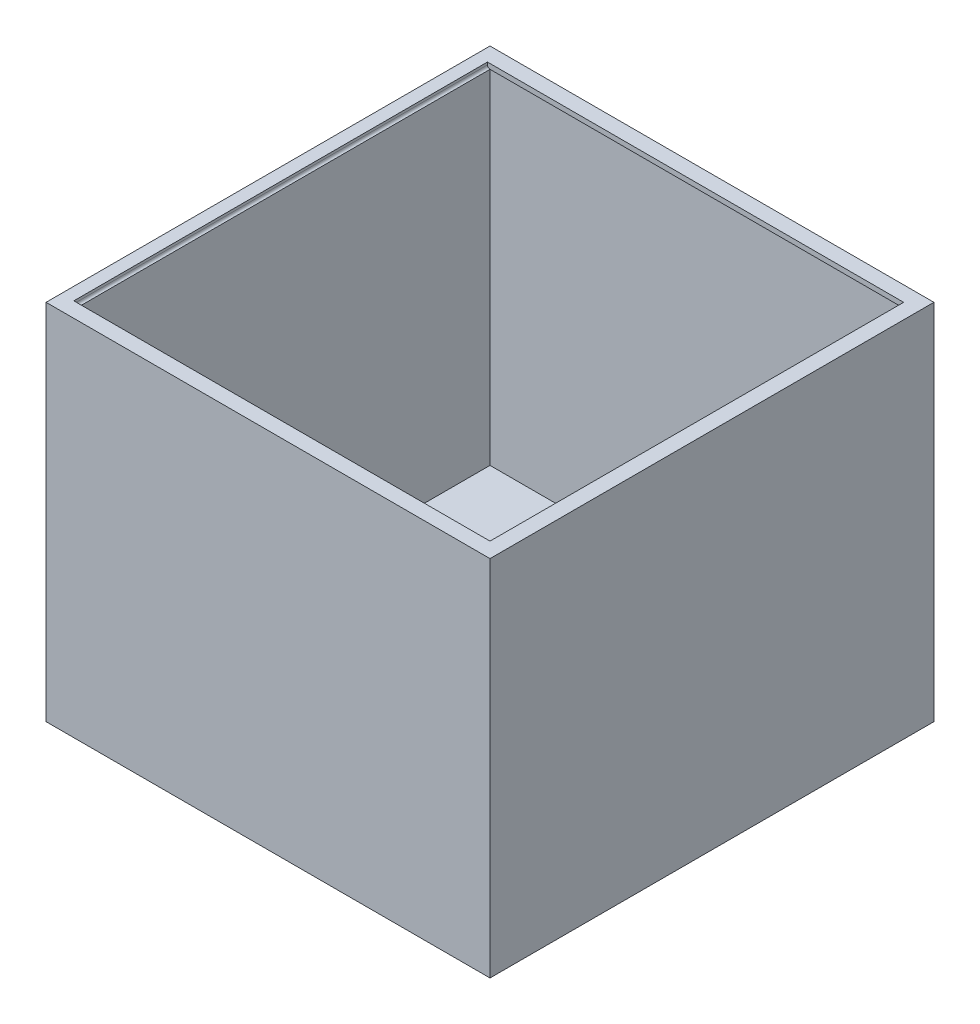
ISO-10303-21;
HEADER;
FILE_DESCRIPTION(('STEP AP214'),'2;1');
FILE_NAME('part.step','',(''),(''),'','','');
FILE_SCHEMA(('AUTOMOTIVE_DESIGN { 1 0 10303 214 1 1 1 1 }'));
ENDSEC;
DATA;
#1=APPLICATION_CONTEXT('core data for automotive mechanical design processes');
#2=APPLICATION_PROTOCOL_DEFINITION('international standard','automotive_design',2000,#1);
#3=PRODUCT_CONTEXT('',#1,'mechanical');
#4=PRODUCT('Part','Part','',(#3));
#5=PRODUCT_RELATED_PRODUCT_CATEGORY('part','',(#4));
#6=PRODUCT_DEFINITION_FORMATION('','',#4);
#7=PRODUCT_DEFINITION_CONTEXT('part definition',#1,'design');
#8=PRODUCT_DEFINITION('design','',#6,#7);
#9=PRODUCT_DEFINITION_SHAPE('','',#8);
#10=(LENGTH_UNIT() NAMED_UNIT(*) SI_UNIT(.MILLI.,.METRE.));
#11=(NAMED_UNIT(*) PLANE_ANGLE_UNIT() SI_UNIT($,.RADIAN.));
#12=(NAMED_UNIT(*) SI_UNIT($,.STERADIAN.) SOLID_ANGLE_UNIT());
#13=UNCERTAINTY_MEASURE_WITH_UNIT(LENGTH_MEASURE(1.E-05),#10,'distance_accuracy_value','');
#14=(GEOMETRIC_REPRESENTATION_CONTEXT(3) GLOBAL_UNCERTAINTY_ASSIGNED_CONTEXT((#13)) GLOBAL_UNIT_ASSIGNED_CONTEXT((#10,
#11,#12)) REPRESENTATION_CONTEXT('',''));
#15=CARTESIAN_POINT('',(0.,0.,0.));
#16=DIRECTION('',(0.,0.,1.));
#17=DIRECTION('',(1.,0.,0.));
#18=AXIS2_PLACEMENT_3D('',#15,#16,#17);
#19=CARTESIAN_POINT('',(2.17628945167999E-13,-60.,0.));
#20=DIRECTION('',(0.,1.,0.));
#21=DIRECTION('',(-1.,0.,0.));
#22=AXIS2_PLACEMENT_3D('',#19,#20,#21);
#23=PLANE('',#22);
#24=DIRECTION('',(0.,0.,1.));
#25=VECTOR('',#24,1.);
#26=CARTESIAN_POINT('',(-220.,-60.0000000000008,-220.));
#27=LINE('',#26,#25);
#28=CARTESIAN_POINT('',(-220.,-60.0000000000008,-220.));
#29=VERTEX_POINT('',#28);
#30=CARTESIAN_POINT('',(-220.,-60.0000000000008,220.));
#31=VERTEX_POINT('',#30);
#32=EDGE_CURVE('E216',#29,#31,#27,.T.);
#33=ORIENTED_EDGE('',*,*,#32,.F.);
#34=DIRECTION('',(-1.,0.,0.));
#35=VECTOR('',#34,1.);
#36=CARTESIAN_POINT('',(220.,-59.9999999999992,-220.));
#37=LINE('',#36,#35);
#38=CARTESIAN_POINT('',(220.,-59.9999999999992,-220.));
#39=VERTEX_POINT('',#38);
#40=EDGE_CURVE('E201',#39,#29,#37,.T.);
#41=ORIENTED_EDGE('',*,*,#40,.F.);
#42=DIRECTION('',(0.,0.,-1.));
#43=VECTOR('',#42,1.);
#44=CARTESIAN_POINT('',(220.,-59.9999999999992,220.));
#45=LINE('',#44,#43);
#46=CARTESIAN_POINT('',(220.,-59.9999999999992,220.));
#47=VERTEX_POINT('',#46);
#48=EDGE_CURVE('E206',#47,#39,#45,.T.);
#49=ORIENTED_EDGE('',*,*,#48,.F.);
#50=DIRECTION('',(1.,0.,0.));
#51=VECTOR('',#50,1.);
#52=CARTESIAN_POINT('',(-220.,-60.0000000000008,220.));
#53=LINE('',#52,#51);
#54=EDGE_CURVE('E211',#31,#47,#53,.T.);
#55=ORIENTED_EDGE('',*,*,#54,.F.);
#56=EDGE_LOOP('',(#33,#41,#49,#55));
#57=FACE_BOUND('',#56,.T.);
#58=ADVANCED_FACE('F39',(#57),#23,.F.);
#59=CARTESIAN_POINT('',(-220.000000000003,922.253967444163,-220.));
#60=DIRECTION('',(1.,0.,0.));
#61=DIRECTION('',(0.,1.,0.));
#62=AXIS2_PLACEMENT_3D('',#59,#60,#61);
#63=PLANE('',#62);
#64=ORIENTED_EDGE('',*,*,#32,.T.);
#65=DIRECTION('',(0.,-1.,0.));
#66=VECTOR('',#65,1.);
#67=CARTESIAN_POINT('',(-220.000000000003,922.253967444163,220.));
#68=LINE('',#67,#66);
#69=CARTESIAN_POINT('',(-220.000000000003,300.,220.));
#70=VERTEX_POINT('',#69);
#71=EDGE_CURVE('E215',#70,#31,#68,.T.);
#72=ORIENTED_EDGE('',*,*,#71,.F.);
#73=DIRECTION('',(0.,0.,-1.));
#74=VECTOR('',#73,1.);
#75=CARTESIAN_POINT('',(-220.000000000001,300.,-220.));
#76=LINE('',#75,#74);
#77=CARTESIAN_POINT('',(-220.000000000004,300.,-220.));
#78=VERTEX_POINT('',#77);
#79=EDGE_CURVE('E200',#70,#78,#76,.T.);
#80=ORIENTED_EDGE('',*,*,#79,.T.);
#81=DIRECTION('',(0.,-1.,0.));
#82=VECTOR('',#81,1.);
#83=CARTESIAN_POINT('',(-220.000000000003,922.253967444163,-220.));
#84=LINE('',#83,#82);
#85=EDGE_CURVE('E220',#78,#29,#84,.T.);
#86=ORIENTED_EDGE('',*,*,#85,.T.);
#87=EDGE_LOOP('',(#64,#72,#80,#86));
#88=FACE_BOUND('',#87,.T.);
#89=ADVANCED_FACE('F274',(#88),#63,.F.);
#90=CARTESIAN_POINT('',(-220.000000000003,922.253967444163,220.));
#91=DIRECTION('',(0.,0.,-1.));
#92=DIRECTION('',(-1.,0.,0.));
#93=AXIS2_PLACEMENT_3D('',#90,#91,#92);
#94=PLANE('',#93);
#95=ORIENTED_EDGE('',*,*,#54,.T.);
#96=DIRECTION('',(0.,-1.,0.));
#97=VECTOR('',#96,1.);
#98=CARTESIAN_POINT('',(219.999999999996,922.253967444165,220.));
#99=LINE('',#98,#97);
#100=CARTESIAN_POINT('',(219.999999999999,300.000000000005,220.));
#101=VERTEX_POINT('',#100);
#102=EDGE_CURVE('E210',#101,#47,#99,.T.);
#103=ORIENTED_EDGE('',*,*,#102,.F.);
#104=DIRECTION('',(-1.,0.,0.));
#105=VECTOR('',#104,1.);
#106=CARTESIAN_POINT('',(-219.999999999997,300.,220.));
#107=LINE('',#106,#105);
#108=EDGE_CURVE('E219',#101,#70,#107,.T.);
#109=ORIENTED_EDGE('',*,*,#108,.T.);
#110=ORIENTED_EDGE('',*,*,#71,.T.);
#111=EDGE_LOOP('',(#95,#103,#109,#110));
#112=FACE_BOUND('',#111,.T.);
#113=ADVANCED_FACE('F280',(#112),#94,.F.);
#114=CARTESIAN_POINT('',(219.999999999996,922.253967444165,220.));
#115=DIRECTION('',(-1.,0.,0.));
#116=DIRECTION('',(0.,-1.,0.));
#117=AXIS2_PLACEMENT_3D('',#114,#115,#116);
#118=PLANE('',#117);
#119=ORIENTED_EDGE('',*,*,#48,.T.);
#120=DIRECTION('',(0.,-1.,0.));
#121=VECTOR('',#120,1.);
#122=CARTESIAN_POINT('',(219.999999999996,922.253967444165,-220.));
#123=LINE('',#122,#121);
#124=CARTESIAN_POINT('',(219.999999999999,300.000000000003,-220.));
#125=VERTEX_POINT('',#124);
#126=EDGE_CURVE('E205',#125,#39,#123,.T.);
#127=ORIENTED_EDGE('',*,*,#126,.F.);
#128=DIRECTION('',(0.,0.,1.));
#129=VECTOR('',#128,1.);
#130=CARTESIAN_POINT('',(219.999999999999,300.000000000005,220.));
#131=LINE('',#130,#129);
#132=EDGE_CURVE('E214',#125,#101,#131,.T.);
#133=ORIENTED_EDGE('',*,*,#132,.T.);
#134=ORIENTED_EDGE('',*,*,#102,.T.);
#135=EDGE_LOOP('',(#119,#127,#133,#134));
#136=FACE_BOUND('',#135,.T.);
#137=ADVANCED_FACE('F289',(#136),#118,.F.);
#138=CARTESIAN_POINT('',(219.999999999996,922.253967444165,-220.));
#139=DIRECTION('',(0.,0.,1.));
#140=DIRECTION('',(1.,0.,0.));
#141=AXIS2_PLACEMENT_3D('',#138,#139,#140);
#142=PLANE('',#141);
#143=ORIENTED_EDGE('',*,*,#40,.T.);
#144=ORIENTED_EDGE('',*,*,#85,.F.);
#145=DIRECTION('',(1.,0.,0.));
#146=VECTOR('',#145,1.);
#147=CARTESIAN_POINT('',(220.000000000003,300.000000000005,-220.));
#148=LINE('',#147,#146);
#149=EDGE_CURVE('E209',#78,#125,#148,.T.);
#150=ORIENTED_EDGE('',*,*,#149,.T.);
#151=ORIENTED_EDGE('',*,*,#126,.T.);
#152=EDGE_LOOP('',(#143,#144,#150,#151));
#153=FACE_BOUND('',#152,.T.);
#154=ADVANCED_FACE('F286',(#153),#142,.F.);
#155=CARTESIAN_POINT('',(-3.33066907387549E-12,300.000000000002,210.));
#156=DIRECTION('',(0.,-1.,0.));
#157=DIRECTION('',(1.,0.,0.));
#158=AXIS2_PLACEMENT_3D('',#155,#156,#157);
#159=PLANE('',#158);
#160=ORIENTED_EDGE('',*,*,#108,.F.);
#161=ORIENTED_EDGE('',*,*,#132,.F.);
#162=ORIENTED_EDGE('',*,*,#149,.F.);
#163=ORIENTED_EDGE('',*,*,#79,.F.);
#164=EDGE_LOOP('',(#160,#161,#162,#163));
#165=FACE_BOUND('',#164,.T.);
#166=DIRECTION('',(0.,0.,1.));
#167=VECTOR('',#166,1.);
#168=CARTESIAN_POINT('',(-207.500000000003,300.,-210.59016994375));
#169=LINE('',#168,#167);
#170=CARTESIAN_POINT('',(-207.500000000003,300.,-205.));
#171=VERTEX_POINT('',#170);
#172=CARTESIAN_POINT('',(-207.500000000003,300.,205.));
#173=VERTEX_POINT('',#172);
#174=EDGE_CURVE('E139',#171,#173,#169,.T.);
#175=ORIENTED_EDGE('',*,*,#174,.F.);
#176=DIRECTION('',(-1.,0.,0.));
#177=VECTOR('',#176,1.);
#178=CARTESIAN_POINT('',(-205.000000000004,300.,-205.));
#179=LINE('',#178,#177);
#180=CARTESIAN_POINT('',(204.999999999999,300.000000000005,-205.));
#181=VERTEX_POINT('',#180);
#182=EDGE_CURVE('E171',#181,#171,#179,.T.);
#183=ORIENTED_EDGE('',*,*,#182,.F.);
#184=DIRECTION('',(0.,0.,-1.));
#185=VECTOR('',#184,1.);
#186=CARTESIAN_POINT('',(204.999999999999,300.000000000005,-205.));
#187=LINE('',#186,#185);
#188=CARTESIAN_POINT('',(204.999999999999,300.000000000005,205.));
#189=VERTEX_POINT('',#188);
#190=EDGE_CURVE('E141',#189,#181,#187,.T.);
#191=ORIENTED_EDGE('',*,*,#190,.F.);
#192=DIRECTION('',(1.,0.,0.));
#193=VECTOR('',#192,1.);
#194=CARTESIAN_POINT('',(204.999999999999,300.000000000005,205.));
#195=LINE('',#194,#193);
#196=EDGE_CURVE('E136',#173,#189,#195,.T.);
#197=ORIENTED_EDGE('',*,*,#196,.F.);
#198=EDGE_LOOP('',(#175,#183,#191,#197));
#199=FACE_BOUND('',#198,.T.);
#200=ADVANCED_FACE('F41',(#165,#199),#159,.F.);
#201=CARTESIAN_POINT('',(-3.27515792264422E-12,295.000000000002,0.));
#202=DIRECTION('',(0.,-1.,0.));
#203=DIRECTION('',(1.,0.,0.));
#204=AXIS2_PLACEMENT_3D('',#201,#202,#203);
#205=PLANE('',#204);
#206=DIRECTION('',(1.,0.,0.));
#207=VECTOR('',#206,1.);
#208=CARTESIAN_POINT('',(215.000000000003,295.000000000005,-215.));
#209=LINE('',#208,#207);
#210=CARTESIAN_POINT('',(-215.000000000001,295.,-215.));
#211=VERTEX_POINT('',#210);
#212=CARTESIAN_POINT('',(214.999999999999,295.000000000002,-215.));
#213=VERTEX_POINT('',#212);
#214=EDGE_CURVE('E61',#211,#213,#209,.T.);
#215=ORIENTED_EDGE('',*,*,#214,.T.);
#216=DIRECTION('',(0.,0.,1.));
#217=VECTOR('',#216,1.);
#218=CARTESIAN_POINT('',(214.999999999999,295.000000000005,215.));
#219=LINE('',#218,#217);
#220=CARTESIAN_POINT('',(214.999999999999,295.000000000002,215.));
#221=VERTEX_POINT('',#220);
#222=EDGE_CURVE('E54',#213,#221,#219,.T.);
#223=ORIENTED_EDGE('',*,*,#222,.T.);
#224=DIRECTION('',(-1.,0.,0.));
#225=VECTOR('',#224,1.);
#226=CARTESIAN_POINT('',(-214.999999999997,295.,215.));
#227=LINE('',#226,#225);
#228=CARTESIAN_POINT('',(-215.000000000001,295.,215.));
#229=VERTEX_POINT('',#228);
#230=EDGE_CURVE('E11',#221,#229,#227,.T.);
#231=ORIENTED_EDGE('',*,*,#230,.T.);
#232=DIRECTION('',(0.,0.,-1.));
#233=VECTOR('',#232,1.);
#234=CARTESIAN_POINT('',(-215.000000000001,295.,-215.));
#235=LINE('',#234,#233);
#236=EDGE_CURVE('E185',#229,#211,#235,.T.);
#237=ORIENTED_EDGE('',*,*,#236,.T.);
#238=EDGE_LOOP('',(#215,#223,#231,#237));
#239=FACE_BOUND('',#238,.T.);
#240=DIRECTION('',(0.,0.,1.));
#241=VECTOR('',#240,1.);
#242=CARTESIAN_POINT('',(-205.000000000003,295.,205.));
#243=LINE('',#242,#241);
#244=CARTESIAN_POINT('',(-205.000000000003,295.,-205.));
#245=VERTEX_POINT('',#244);
#246=CARTESIAN_POINT('',(-205.000000000003,295.,205.));
#247=VERTEX_POINT('',#246);
#248=EDGE_CURVE('E167',#245,#247,#243,.T.);
#249=ORIENTED_EDGE('',*,*,#248,.T.);
#250=DIRECTION('',(1.,0.,0.));
#251=VECTOR('',#250,1.);
#252=CARTESIAN_POINT('',(204.999999999999,295.000000000005,205.));
#253=LINE('',#252,#251);
#254=CARTESIAN_POINT('',(204.999999999999,295.000000000005,205.));
#255=VERTEX_POINT('',#254);
#256=EDGE_CURVE('E170',#247,#255,#253,.T.);
#257=ORIENTED_EDGE('',*,*,#256,.T.);
#258=DIRECTION('',(0.,0.,-1.));
#259=VECTOR('',#258,1.);
#260=CARTESIAN_POINT('',(204.999999999999,295.000000000005,-205.));
#261=LINE('',#260,#259);
#262=CARTESIAN_POINT('',(204.999999999999,295.000000000005,-205.));
#263=VERTEX_POINT('',#262);
#264=EDGE_CURVE('E174',#255,#263,#261,.T.);
#265=ORIENTED_EDGE('',*,*,#264,.T.);
#266=DIRECTION('',(-1.,0.,0.));
#267=VECTOR('',#266,1.);
#268=CARTESIAN_POINT('',(-205.000000000003,295.,-205.));
#269=LINE('',#268,#267);
#270=EDGE_CURVE('E177',#263,#245,#269,.T.);
#271=ORIENTED_EDGE('',*,*,#270,.T.);
#272=EDGE_LOOP('',(#249,#257,#265,#271));
#273=FACE_BOUND('',#272,.T.);
#274=ADVANCED_FACE('F254',(#239,#273),#205,.T.);
#275=CARTESIAN_POINT('',(-205.000000000003,295.,-205.));
#276=DIRECTION('',(0.,0.,-1.));
#277=DIRECTION('',(-1.,0.,0.));
#278=AXIS2_PLACEMENT_3D('',#275,#276,#277);
#279=PLANE('',#278);
#280=ORIENTED_EDGE('',*,*,#182,.T.);
#281=DIRECTION('',(0.,-1.,0.));
#282=VECTOR('',#281,1.);
#283=CARTESIAN_POINT('',(-207.500000000003,297.5,-205.));
#284=LINE('',#283,#282);
#285=CARTESIAN_POINT('',(-207.500000000003,297.5,-205.));
#286=VERTEX_POINT('',#285);
#287=EDGE_CURVE('E154',#171,#286,#284,.T.);
#288=ORIENTED_EDGE('',*,*,#287,.T.);
#289=CARTESIAN_POINT('',(-205.000000000003,297.5,-205.));
#290=DIRECTION('',(0.,0.,-1.));
#291=DIRECTION('',(-1.,0.,0.));
#292=AXIS2_PLACEMENT_3D('',#289,#290,#291);
#293=CIRCLE('',#292,2.5);
#294=EDGE_CURVE('E145',#286,#245,#293,.F.);
#295=ORIENTED_EDGE('',*,*,#294,.T.);
#296=ORIENTED_EDGE('',*,*,#270,.F.);
#297=DIRECTION('',(0.,1.,0.));
#298=VECTOR('',#297,1.);
#299=CARTESIAN_POINT('',(204.999999999999,295.000000000005,-205.));
#300=LINE('',#299,#298);
#301=EDGE_CURVE('E183',#263,#181,#300,.T.);
#302=ORIENTED_EDGE('',*,*,#301,.T.);
#303=EDGE_LOOP('',(#280,#288,#295,#296,#302));
#304=FACE_BOUND('',#303,.T.);
#305=ADVANCED_FACE('F257',(#304),#279,.F.);
#306=CARTESIAN_POINT('',(204.999999999999,295.000000000005,-205.));
#307=DIRECTION('',(1.,0.,0.));
#308=DIRECTION('',(0.,1.,0.));
#309=AXIS2_PLACEMENT_3D('',#306,#307,#308);
#310=PLANE('',#309);
#311=ORIENTED_EDGE('',*,*,#190,.T.);
#312=ORIENTED_EDGE('',*,*,#301,.F.);
#313=ORIENTED_EDGE('',*,*,#264,.F.);
#314=DIRECTION('',(0.,1.,0.));
#315=VECTOR('',#314,1.);
#316=CARTESIAN_POINT('',(204.999999999999,295.000000000005,205.));
#317=LINE('',#316,#315);
#318=EDGE_CURVE('E179',#255,#189,#317,.T.);
#319=ORIENTED_EDGE('',*,*,#318,.T.);
#320=EDGE_LOOP('',(#311,#312,#313,#319));
#321=FACE_BOUND('',#320,.T.);
#322=ADVANCED_FACE('F264',(#321),#310,.F.);
#323=CARTESIAN_POINT('',(204.999999999999,295.000000000005,205.));
#324=DIRECTION('',(0.,0.,1.));
#325=DIRECTION('',(1.,0.,0.));
#326=AXIS2_PLACEMENT_3D('',#323,#324,#325);
#327=PLANE('',#326);
#328=ORIENTED_EDGE('',*,*,#196,.T.);
#329=ORIENTED_EDGE('',*,*,#318,.F.);
#330=ORIENTED_EDGE('',*,*,#256,.F.);
#331=CARTESIAN_POINT('',(-205.000000000003,297.5,205.));
#332=DIRECTION('',(0.,0.,1.));
#333=DIRECTION('',(1.,0.,0.));
#334=AXIS2_PLACEMENT_3D('',#331,#332,#333);
#335=CIRCLE('',#334,2.5);
#336=CARTESIAN_POINT('',(-207.500000000003,297.5,205.));
#337=VERTEX_POINT('',#336);
#338=EDGE_CURVE('E155',#337,#247,#335,.T.);
#339=ORIENTED_EDGE('',*,*,#338,.F.);
#340=DIRECTION('',(0.,-1.,0.));
#341=VECTOR('',#340,1.);
#342=CARTESIAN_POINT('',(-207.500000000003,297.5,205.));
#343=LINE('',#342,#341);
#344=EDGE_CURVE('E152',#173,#337,#343,.T.);
#345=ORIENTED_EDGE('',*,*,#344,.F.);
#346=EDGE_LOOP('',(#328,#329,#330,#339,#345));
#347=FACE_BOUND('',#346,.T.);
#348=ADVANCED_FACE('F158',(#347),#327,.F.);
#349=CARTESIAN_POINT('',(0.,-55.,0.));
#350=DIRECTION('',(0.,1.,0.));
#351=DIRECTION('',(0.,0.,1.));
#352=AXIS2_PLACEMENT_3D('',#349,#350,#351);
#353=PLANE('',#352);
#354=DIRECTION('',(1.,0.,0.));
#355=VECTOR('',#354,1.);
#356=CARTESIAN_POINT('',(-215.000000000003,-55.,215.));
#357=LINE('',#356,#355);
#358=CARTESIAN_POINT('',(-215.,-55.,215.));
#359=VERTEX_POINT('',#358);
#360=CARTESIAN_POINT('',(215.,-55.,215.));
#361=VERTEX_POINT('',#360);
#362=EDGE_CURVE('E47',#359,#361,#357,.T.);
#363=ORIENTED_EDGE('',*,*,#362,.T.);
#364=DIRECTION('',(0.,0.,-1.));
#365=VECTOR('',#364,1.);
#366=CARTESIAN_POINT('',(215.,-55.,215.));
#367=LINE('',#366,#365);
#368=CARTESIAN_POINT('',(215.,-55.,-215.));
#369=VERTEX_POINT('',#368);
#370=EDGE_CURVE('E197',#361,#369,#367,.T.);
#371=ORIENTED_EDGE('',*,*,#370,.T.);
#372=DIRECTION('',(-1.,0.,0.));
#373=VECTOR('',#372,1.);
#374=CARTESIAN_POINT('',(214.999999999996,-55.,-215.));
#375=LINE('',#374,#373);
#376=CARTESIAN_POINT('',(-215.,-55.,-215.));
#377=VERTEX_POINT('',#376);
#378=EDGE_CURVE('E194',#369,#377,#375,.T.);
#379=ORIENTED_EDGE('',*,*,#378,.T.);
#380=DIRECTION('',(0.,0.,1.));
#381=VECTOR('',#380,1.);
#382=CARTESIAN_POINT('',(-215.,-55.,-215.));
#383=LINE('',#382,#381);
#384=EDGE_CURVE('E191',#377,#359,#383,.T.);
#385=ORIENTED_EDGE('',*,*,#384,.T.);
#386=EDGE_LOOP('',(#363,#371,#379,#385));
#387=FACE_BOUND('',#386,.T.);
#388=ADVANCED_FACE('F242',(#387),#353,.T.);
#389=CARTESIAN_POINT('',(-215.000000000003,922.253967444163,215.));
#390=DIRECTION('',(0.,0.,-1.));
#391=DIRECTION('',(-1.,0.,0.));
#392=AXIS2_PLACEMENT_3D('',#389,#390,#391);
#393=PLANE('',#392);
#394=ORIENTED_EDGE('',*,*,#230,.F.);
#395=DIRECTION('',(0.,-1.,0.));
#396=VECTOR('',#395,1.);
#397=CARTESIAN_POINT('',(214.999999999996,922.253967444165,215.));
#398=LINE('',#397,#396);
#399=EDGE_CURVE('E230',#221,#361,#398,.T.);
#400=ORIENTED_EDGE('',*,*,#399,.T.);
#401=ORIENTED_EDGE('',*,*,#362,.F.);
#402=DIRECTION('',(0.,-1.,0.));
#403=VECTOR('',#402,1.);
#404=CARTESIAN_POINT('',(-215.000000000003,922.253967444163,215.));
#405=LINE('',#404,#403);
#406=EDGE_CURVE('E228',#229,#359,#405,.T.);
#407=ORIENTED_EDGE('',*,*,#406,.F.);
#408=EDGE_LOOP('',(#394,#400,#401,#407));
#409=FACE_BOUND('',#408,.T.);
#410=ADVANCED_FACE('F246',(#409),#393,.T.);
#411=CARTESIAN_POINT('',(-215.000000000004,922.253967444163,-215.));
#412=DIRECTION('',(1.,0.,0.));
#413=DIRECTION('',(0.,1.,0.));
#414=AXIS2_PLACEMENT_3D('',#411,#412,#413);
#415=PLANE('',#414);
#416=ORIENTED_EDGE('',*,*,#236,.F.);
#417=ORIENTED_EDGE('',*,*,#406,.T.);
#418=ORIENTED_EDGE('',*,*,#384,.F.);
#419=DIRECTION('',(0.,-1.,0.));
#420=VECTOR('',#419,1.);
#421=CARTESIAN_POINT('',(-215.000000000004,922.253967444163,-215.));
#422=LINE('',#421,#420);
#423=EDGE_CURVE('E226',#211,#377,#422,.T.);
#424=ORIENTED_EDGE('',*,*,#423,.F.);
#425=EDGE_LOOP('',(#416,#417,#418,#424));
#426=FACE_BOUND('',#425,.T.);
#427=ADVANCED_FACE('F252',(#426),#415,.T.);
#428=CARTESIAN_POINT('',(214.999999999996,922.253967444165,-215.));
#429=DIRECTION('',(0.,0.,1.));
#430=DIRECTION('',(1.,0.,0.));
#431=AXIS2_PLACEMENT_3D('',#428,#429,#430);
#432=PLANE('',#431);
#433=ORIENTED_EDGE('',*,*,#214,.F.);
#434=ORIENTED_EDGE('',*,*,#423,.T.);
#435=ORIENTED_EDGE('',*,*,#378,.F.);
#436=DIRECTION('',(0.,-1.,0.));
#437=VECTOR('',#436,1.);
#438=CARTESIAN_POINT('',(214.999999999996,922.253967444165,-215.));
#439=LINE('',#438,#437);
#440=EDGE_CURVE('E204',#213,#369,#439,.T.);
#441=ORIENTED_EDGE('',*,*,#440,.F.);
#442=EDGE_LOOP('',(#433,#434,#435,#441));
#443=FACE_BOUND('',#442,.T.);
#444=ADVANCED_FACE('F250',(#443),#432,.T.);
#445=CARTESIAN_POINT('',(214.999999999996,922.253967444165,215.));
#446=DIRECTION('',(-1.,0.,0.));
#447=DIRECTION('',(0.,-1.,0.));
#448=AXIS2_PLACEMENT_3D('',#445,#446,#447);
#449=PLANE('',#448);
#450=ORIENTED_EDGE('',*,*,#222,.F.);
#451=ORIENTED_EDGE('',*,*,#440,.T.);
#452=ORIENTED_EDGE('',*,*,#370,.F.);
#453=ORIENTED_EDGE('',*,*,#399,.F.);
#454=EDGE_LOOP('',(#450,#451,#452,#453));
#455=FACE_BOUND('',#454,.T.);
#456=ADVANCED_FACE('F248',(#455),#449,.T.);
#457=CARTESIAN_POINT('',(-207.500000000003,297.5,-210.59016994375));
#458=DIRECTION('',(-1.,0.,0.));
#459=DIRECTION('',(0.,0.,1.));
#460=AXIS2_PLACEMENT_3D('',#457,#458,#459);
#461=PLANE('',#460);
#462=ORIENTED_EDGE('',*,*,#174,.T.);
#463=ORIENTED_EDGE('',*,*,#344,.T.);
#464=DIRECTION('',(0.,0.,1.));
#465=VECTOR('',#464,1.);
#466=CARTESIAN_POINT('',(-207.500000000003,297.5,-210.59016994375));
#467=LINE('',#466,#465);
#468=EDGE_CURVE('E164',#286,#337,#467,.T.);
#469=ORIENTED_EDGE('',*,*,#468,.F.);
#470=ORIENTED_EDGE('',*,*,#287,.F.);
#471=EDGE_LOOP('',(#462,#463,#469,#470));
#472=FACE_BOUND('',#471,.T.);
#473=ADVANCED_FACE('F150',(#472),#461,.F.);
#474=CARTESIAN_POINT('',(-205.000000000003,297.5,-210.59016994375));
#475=DIRECTION('',(0.,0.,1.));
#476=DIRECTION('',(1.,0.,0.));
#477=AXIS2_PLACEMENT_3D('',#474,#475,#476);
#478=CYLINDRICAL_SURFACE('',#477,2.5);
#479=ORIENTED_EDGE('',*,*,#468,.T.);
#480=ORIENTED_EDGE('',*,*,#338,.T.);
#481=ORIENTED_EDGE('',*,*,#248,.F.);
#482=ORIENTED_EDGE('',*,*,#294,.F.);
#483=EDGE_LOOP('',(#479,#480,#481,#482));
#484=FACE_BOUND('',#483,.T.);
#485=ADVANCED_FACE('F262',(#484),#478,.F.);
#486=CLOSED_SHELL('',(#58,#89,#113,#137,#154,#200,#274,#305,#322,#348,#388,#410,#427,#444,#456,
#473,#485));
#487=MANIFOLD_SOLID_BREP('B2',#486);
#488=ADVANCED_BREP_SHAPE_REPRESENTATION('',(#18,#487),#14);
#489=SHAPE_DEFINITION_REPRESENTATION(#9,#488);
ENDSEC;
END-ISO-10303-21;
